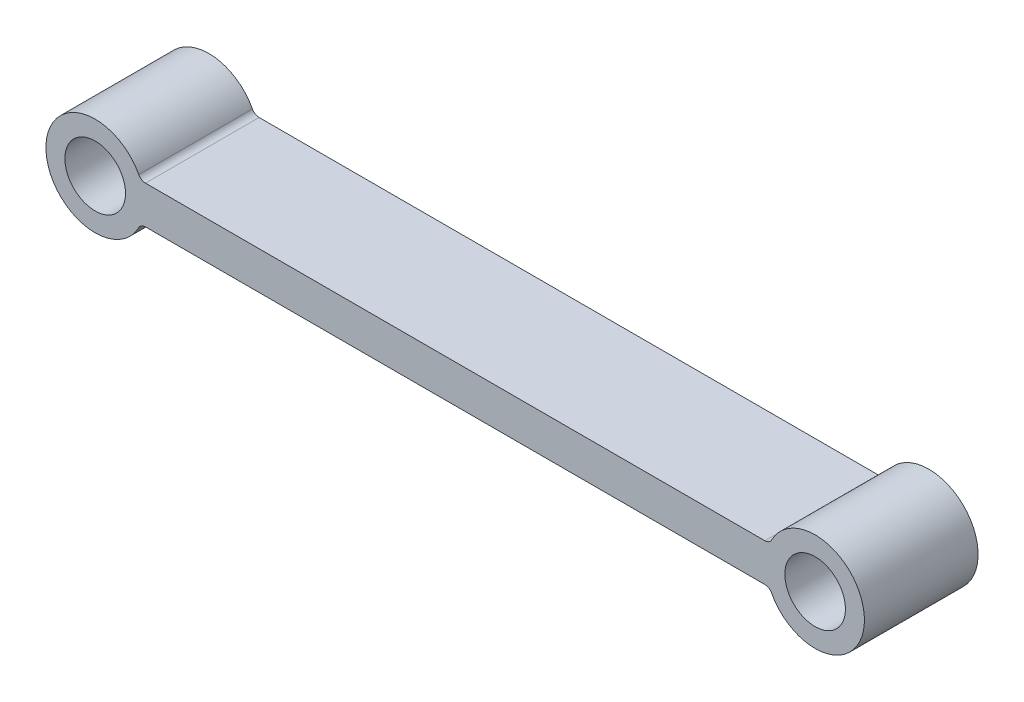
ISO-10303-21;
HEADER;
FILE_DESCRIPTION(('STEP AP214'),'2;1');
FILE_NAME('part.step','',(''),(''),'','','');
FILE_SCHEMA(('AUTOMOTIVE_DESIGN { 1 0 10303 214 1 1 1 1 }'));
ENDSEC;
DATA;
#1=APPLICATION_CONTEXT('core data for automotive mechanical design processes');
#2=APPLICATION_PROTOCOL_DEFINITION('international standard','automotive_design',2000,#1);
#3=PRODUCT_CONTEXT('',#1,'mechanical');
#4=PRODUCT('Part','Part','',(#3));
#5=PRODUCT_RELATED_PRODUCT_CATEGORY('part','',(#4));
#6=PRODUCT_DEFINITION_FORMATION('','',#4);
#7=PRODUCT_DEFINITION_CONTEXT('part definition',#1,'design');
#8=PRODUCT_DEFINITION('design','',#6,#7);
#9=PRODUCT_DEFINITION_SHAPE('','',#8);
#10=(LENGTH_UNIT() NAMED_UNIT(*) SI_UNIT(.MILLI.,.METRE.));
#11=(NAMED_UNIT(*) PLANE_ANGLE_UNIT() SI_UNIT($,.RADIAN.));
#12=(NAMED_UNIT(*) SI_UNIT($,.STERADIAN.) SOLID_ANGLE_UNIT());
#13=UNCERTAINTY_MEASURE_WITH_UNIT(LENGTH_MEASURE(1.E-05),#10,'distance_accuracy_value','');
#14=(GEOMETRIC_REPRESENTATION_CONTEXT(3) GLOBAL_UNCERTAINTY_ASSIGNED_CONTEXT((#13)) GLOBAL_UNIT_ASSIGNED_CONTEXT((#10,
#11,#12)) REPRESENTATION_CONTEXT('',''));
#15=CARTESIAN_POINT('',(0.,0.,0.));
#16=DIRECTION('',(0.,0.,1.));
#17=DIRECTION('',(1.,0.,0.));
#18=AXIS2_PLACEMENT_3D('',#15,#16,#17);
#19=CARTESIAN_POINT('',(-40.8667504192892,3.5,15.));
#20=DIRECTION('',(0.,0.,1.));
#21=DIRECTION('',(1.,0.,0.));
#22=AXIS2_PLACEMENT_3D('',#19,#20,#21);
#23=PLANE('',#22);
#24=CARTESIAN_POINT('',(-47.5,0.,15.));
#25=DIRECTION('',(0.,0.,1.));
#26=DIRECTION('',(1.,0.,0.));
#27=AXIS2_PLACEMENT_3D('',#24,#25,#26);
#28=CIRCLE('',#27,4.);
#29=CARTESIAN_POINT('',(-43.5,0.,15.));
#30=VERTEX_POINT('',#29);
#31=EDGE_CURVE('E142',#30,#30,#28,.T.);
#32=ORIENTED_EDGE('',*,*,#31,.F.);
#33=EDGE_LOOP('',(#32));
#34=FACE_BOUND('',#33,.T.);
#35=CARTESIAN_POINT('',(-40.8667504192892,3.5,15.));
#36=DIRECTION('',(0.,0.,-1.));
#37=DIRECTION('',(1.,0.,0.));
#38=AXIS2_PLACEMENT_3D('',#35,#36,#37);
#39=CIRCLE('',#38,0.999999999999999);
#40=CARTESIAN_POINT('',(-40.8667504192892,2.5,15.));
#41=VERTEX_POINT('',#40);
#42=CARTESIAN_POINT('',(-41.7511836967173,3.03333333333333,15.));
#43=VERTEX_POINT('',#42);
#44=EDGE_CURVE('E153',#41,#43,#39,.T.);
#45=ORIENTED_EDGE('',*,*,#44,.T.);
#46=CARTESIAN_POINT('',(-47.5,0.,15.));
#47=DIRECTION('',(0.,0.,1.));
#48=DIRECTION('',(1.,0.,0.));
#49=AXIS2_PLACEMENT_3D('',#46,#47,#48);
#50=CIRCLE('',#49,6.5);
#51=CARTESIAN_POINT('',(-41.7511836967173,-3.03333333333334,15.));
#52=VERTEX_POINT('',#51);
#53=EDGE_CURVE('E101',#43,#52,#50,.T.);
#54=ORIENTED_EDGE('',*,*,#53,.T.);
#55=CARTESIAN_POINT('',(-40.8667504192892,-3.5,15.));
#56=DIRECTION('',(0.,0.,-1.));
#57=DIRECTION('',(-1.,0.,0.));
#58=AXIS2_PLACEMENT_3D('',#55,#56,#57);
#59=CIRCLE('',#58,0.999999999999999);
#60=CARTESIAN_POINT('',(-40.8667504192892,-2.5,15.));
#61=VERTEX_POINT('',#60);
#62=EDGE_CURVE('E168',#52,#61,#59,.T.);
#63=ORIENTED_EDGE('',*,*,#62,.T.);
#64=DIRECTION('',(1.,0.,0.));
#65=VECTOR('',#64,1.);
#66=CARTESIAN_POINT('',(-40.8667504192892,-2.5,15.));
#67=LINE('',#66,#65);
#68=CARTESIAN_POINT('',(40.8667504192892,-2.5,15.));
#69=VERTEX_POINT('',#68);
#70=EDGE_CURVE('E181',#61,#69,#67,.T.);
#71=ORIENTED_EDGE('',*,*,#70,.T.);
#72=CARTESIAN_POINT('',(40.8667504192892,-3.5,15.));
#73=DIRECTION('',(0.,0.,-1.));
#74=DIRECTION('',(1.,0.,0.));
#75=AXIS2_PLACEMENT_3D('',#72,#73,#74);
#76=CIRCLE('',#75,0.999999999999999);
#77=CARTESIAN_POINT('',(41.7511836967173,-3.03333333333333,15.));
#78=VERTEX_POINT('',#77);
#79=EDGE_CURVE('E120',#69,#78,#76,.T.);
#80=ORIENTED_EDGE('',*,*,#79,.T.);
#81=CARTESIAN_POINT('',(47.5,0.,15.));
#82=DIRECTION('',(0.,0.,1.));
#83=DIRECTION('',(-1.,0.,0.));
#84=AXIS2_PLACEMENT_3D('',#81,#82,#83);
#85=CIRCLE('',#84,6.5);
#86=CARTESIAN_POINT('',(41.7511836967173,3.03333333333333,15.));
#87=VERTEX_POINT('',#86);
#88=EDGE_CURVE('E114',#78,#87,#85,.T.);
#89=ORIENTED_EDGE('',*,*,#88,.T.);
#90=CARTESIAN_POINT('',(40.8667504192892,3.5,15.));
#91=DIRECTION('',(0.,0.,-1.));
#92=DIRECTION('',(-1.,0.,0.));
#93=AXIS2_PLACEMENT_3D('',#90,#91,#92);
#94=CIRCLE('',#93,0.999999999999999);
#95=CARTESIAN_POINT('',(40.8667504192892,2.5,15.));
#96=VERTEX_POINT('',#95);
#97=EDGE_CURVE('E118',#87,#96,#94,.T.);
#98=ORIENTED_EDGE('',*,*,#97,.T.);
#99=DIRECTION('',(-1.,0.,0.));
#100=VECTOR('',#99,1.);
#101=CARTESIAN_POINT('',(-40.8667504192892,2.5,15.));
#102=LINE('',#101,#100);
#103=EDGE_CURVE('E58',#96,#41,#102,.T.);
#104=ORIENTED_EDGE('',*,*,#103,.T.);
#105=EDGE_LOOP('',(#45,#54,#63,#71,#80,#89,#98,#104));
#106=FACE_BOUND('',#105,.T.);
#107=CARTESIAN_POINT('',(47.5,0.,15.));
#108=DIRECTION('',(0.,0.,1.));
#109=DIRECTION('',(-1.,0.,0.));
#110=AXIS2_PLACEMENT_3D('',#107,#108,#109);
#111=CIRCLE('',#110,4.);
#112=CARTESIAN_POINT('',(43.5,0.,15.));
#113=VERTEX_POINT('',#112);
#114=EDGE_CURVE('E190',#113,#113,#111,.T.);
#115=ORIENTED_EDGE('',*,*,#114,.F.);
#116=EDGE_LOOP('',(#115));
#117=FACE_BOUND('',#116,.T.);
#118=ADVANCED_FACE('F41',(#34,#106,#117),#23,.T.);
#119=CARTESIAN_POINT('',(-40.8667504192892,3.5,0.));
#120=DIRECTION('',(0.,0.,1.));
#121=DIRECTION('',(1.,0.,0.));
#122=AXIS2_PLACEMENT_3D('',#119,#120,#121);
#123=PLANE('',#122);
#124=CARTESIAN_POINT('',(-40.8667504192892,3.5,0.));
#125=DIRECTION('',(0.,0.,-1.));
#126=DIRECTION('',(1.,0.,0.));
#127=AXIS2_PLACEMENT_3D('',#124,#125,#126);
#128=CIRCLE('',#127,0.999999999999999);
#129=CARTESIAN_POINT('',(-40.8667504192892,2.5,0.));
#130=VERTEX_POINT('',#129);
#131=CARTESIAN_POINT('',(-41.7511836967173,3.03333333333333,0.));
#132=VERTEX_POINT('',#131);
#133=EDGE_CURVE('E138',#130,#132,#128,.T.);
#134=ORIENTED_EDGE('',*,*,#133,.F.);
#135=DIRECTION('',(-1.,0.,0.));
#136=VECTOR('',#135,1.);
#137=CARTESIAN_POINT('',(-40.8667504192892,2.5,0.));
#138=LINE('',#137,#136);
#139=CARTESIAN_POINT('',(40.8667504192892,2.5,0.));
#140=VERTEX_POINT('',#139);
#141=EDGE_CURVE('E93',#140,#130,#138,.T.);
#142=ORIENTED_EDGE('',*,*,#141,.F.);
#143=CARTESIAN_POINT('',(40.8667504192892,3.5,0.));
#144=DIRECTION('',(0.,0.,-1.));
#145=DIRECTION('',(-1.,0.,0.));
#146=AXIS2_PLACEMENT_3D('',#143,#144,#145);
#147=CIRCLE('',#146,0.999999999999999);
#148=CARTESIAN_POINT('',(41.7511836967173,3.03333333333333,0.));
#149=VERTEX_POINT('',#148);
#150=EDGE_CURVE('E87',#149,#140,#147,.T.);
#151=ORIENTED_EDGE('',*,*,#150,.F.);
#152=CARTESIAN_POINT('',(47.5,0.,0.));
#153=DIRECTION('',(0.,0.,1.));
#154=DIRECTION('',(-1.,0.,0.));
#155=AXIS2_PLACEMENT_3D('',#152,#153,#154);
#156=CIRCLE('',#155,6.5);
#157=CARTESIAN_POINT('',(41.7511836967173,-3.03333333333333,0.));
#158=VERTEX_POINT('',#157);
#159=EDGE_CURVE('E128',#158,#149,#156,.T.);
#160=ORIENTED_EDGE('',*,*,#159,.F.);
#161=CARTESIAN_POINT('',(40.8667504192892,-3.5,0.));
#162=DIRECTION('',(0.,0.,-1.));
#163=DIRECTION('',(1.,0.,0.));
#164=AXIS2_PLACEMENT_3D('',#161,#162,#163);
#165=CIRCLE('',#164,0.999999999999999);
#166=CARTESIAN_POINT('',(40.8667504192892,-2.5,0.));
#167=VERTEX_POINT('',#166);
#168=EDGE_CURVE('E148',#167,#158,#165,.T.);
#169=ORIENTED_EDGE('',*,*,#168,.F.);
#170=DIRECTION('',(1.,0.,0.));
#171=VECTOR('',#170,1.);
#172=CARTESIAN_POINT('',(-40.8667504192892,-2.5,0.));
#173=LINE('',#172,#171);
#174=CARTESIAN_POINT('',(-40.8667504192892,-2.5,0.));
#175=VERTEX_POINT('',#174);
#176=EDGE_CURVE('E146',#175,#167,#173,.T.);
#177=ORIENTED_EDGE('',*,*,#176,.F.);
#178=CARTESIAN_POINT('',(-40.8667504192892,-3.5,0.));
#179=DIRECTION('',(0.,0.,-1.));
#180=DIRECTION('',(-1.,0.,0.));
#181=AXIS2_PLACEMENT_3D('',#178,#179,#180);
#182=CIRCLE('',#181,0.999999999999999);
#183=CARTESIAN_POINT('',(-41.7511836967173,-3.03333333333334,0.));
#184=VERTEX_POINT('',#183);
#185=EDGE_CURVE('E144',#184,#175,#182,.T.);
#186=ORIENTED_EDGE('',*,*,#185,.F.);
#187=CARTESIAN_POINT('',(-47.5,0.,0.));
#188=DIRECTION('',(0.,0.,1.));
#189=DIRECTION('',(1.,0.,0.));
#190=AXIS2_PLACEMENT_3D('',#187,#188,#189);
#191=CIRCLE('',#190,6.5);
#192=EDGE_CURVE('E141',#132,#184,#191,.T.);
#193=ORIENTED_EDGE('',*,*,#192,.F.);
#194=EDGE_LOOP('',(#134,#142,#151,#160,#169,#177,#186,#193));
#195=FACE_BOUND('',#194,.T.);
#196=CARTESIAN_POINT('',(-47.5,0.,0.));
#197=DIRECTION('',(0.,0.,1.));
#198=DIRECTION('',(1.,0.,0.));
#199=AXIS2_PLACEMENT_3D('',#196,#197,#198);
#200=CIRCLE('',#199,4.);
#201=CARTESIAN_POINT('',(-43.5,0.,0.));
#202=VERTEX_POINT('',#201);
#203=EDGE_CURVE('E187',#202,#202,#200,.T.);
#204=ORIENTED_EDGE('',*,*,#203,.T.);
#205=EDGE_LOOP('',(#204));
#206=FACE_BOUND('',#205,.T.);
#207=CARTESIAN_POINT('',(47.5,0.,0.));
#208=DIRECTION('',(0.,0.,1.));
#209=DIRECTION('',(-1.,0.,0.));
#210=AXIS2_PLACEMENT_3D('',#207,#208,#209);
#211=CIRCLE('',#210,4.);
#212=CARTESIAN_POINT('',(43.5,0.,0.));
#213=VERTEX_POINT('',#212);
#214=EDGE_CURVE('E193',#213,#213,#211,.T.);
#215=ORIENTED_EDGE('',*,*,#214,.T.);
#216=EDGE_LOOP('',(#215));
#217=FACE_BOUND('',#216,.T.);
#218=ADVANCED_FACE('F172',(#195,#206,#217),#123,.F.);
#219=CARTESIAN_POINT('',(-40.8667504192892,3.5,15.));
#220=DIRECTION('',(0.,0.,-1.));
#221=DIRECTION('',(-1.,0.,0.));
#222=AXIS2_PLACEMENT_3D('',#219,#220,#221);
#223=CYLINDRICAL_SURFACE('',#222,0.999999999999999);
#224=ORIENTED_EDGE('',*,*,#133,.T.);
#225=DIRECTION('',(0.,0.,-1.));
#226=VECTOR('',#225,1.);
#227=CARTESIAN_POINT('',(-41.7511836967173,3.03333333333333,15.));
#228=LINE('',#227,#226);
#229=EDGE_CURVE('E11',#43,#132,#228,.T.);
#230=ORIENTED_EDGE('',*,*,#229,.F.);
#231=ORIENTED_EDGE('',*,*,#44,.F.);
#232=DIRECTION('',(0.,0.,-1.));
#233=VECTOR('',#232,1.);
#234=CARTESIAN_POINT('',(-40.8667504192892,2.5,15.));
#235=LINE('',#234,#233);
#236=EDGE_CURVE('E134',#41,#130,#235,.T.);
#237=ORIENTED_EDGE('',*,*,#236,.T.);
#238=EDGE_LOOP('',(#224,#230,#231,#237));
#239=FACE_BOUND('',#238,.T.);
#240=ADVANCED_FACE('F43',(#239),#223,.F.);
#241=CARTESIAN_POINT('',(-47.5,0.,15.));
#242=DIRECTION('',(0.,0.,-1.));
#243=DIRECTION('',(-1.,0.,0.));
#244=AXIS2_PLACEMENT_3D('',#241,#242,#243);
#245=CYLINDRICAL_SURFACE('',#244,6.5);
#246=ORIENTED_EDGE('',*,*,#192,.T.);
#247=DIRECTION('',(0.,0.,-1.));
#248=VECTOR('',#247,1.);
#249=CARTESIAN_POINT('',(-41.7511836967173,-3.03333333333334,15.));
#250=LINE('',#249,#248);
#251=EDGE_CURVE('E50',#52,#184,#250,.T.);
#252=ORIENTED_EDGE('',*,*,#251,.F.);
#253=ORIENTED_EDGE('',*,*,#53,.F.);
#254=ORIENTED_EDGE('',*,*,#229,.T.);
#255=EDGE_LOOP('',(#246,#252,#253,#254));
#256=FACE_BOUND('',#255,.T.);
#257=ADVANCED_FACE('F225',(#256),#245,.T.);
#258=CARTESIAN_POINT('',(-40.8667504192892,-3.5,15.));
#259=DIRECTION('',(0.,0.,-1.));
#260=DIRECTION('',(-1.,0.,0.));
#261=AXIS2_PLACEMENT_3D('',#258,#259,#260);
#262=CYLINDRICAL_SURFACE('',#261,0.999999999999999);
#263=ORIENTED_EDGE('',*,*,#185,.T.);
#264=DIRECTION('',(0.,0.,-1.));
#265=VECTOR('',#264,1.);
#266=CARTESIAN_POINT('',(-40.8667504192892,-2.5,15.));
#267=LINE('',#266,#265);
#268=EDGE_CURVE('E160',#61,#175,#267,.T.);
#269=ORIENTED_EDGE('',*,*,#268,.F.);
#270=ORIENTED_EDGE('',*,*,#62,.F.);
#271=ORIENTED_EDGE('',*,*,#251,.T.);
#272=EDGE_LOOP('',(#263,#269,#270,#271));
#273=FACE_BOUND('',#272,.T.);
#274=ADVANCED_FACE('F166',(#273),#262,.F.);
#275=CARTESIAN_POINT('',(-40.8667504192892,-2.5,15.));
#276=DIRECTION('',(0.,1.,0.));
#277=DIRECTION('',(0.,0.,1.));
#278=AXIS2_PLACEMENT_3D('',#275,#276,#277);
#279=PLANE('',#278);
#280=ORIENTED_EDGE('',*,*,#176,.T.);
#281=DIRECTION('',(0.,0.,-1.));
#282=VECTOR('',#281,1.);
#283=CARTESIAN_POINT('',(40.8667504192892,-2.5,15.));
#284=LINE('',#283,#282);
#285=EDGE_CURVE('E157',#69,#167,#284,.T.);
#286=ORIENTED_EDGE('',*,*,#285,.F.);
#287=ORIENTED_EDGE('',*,*,#70,.F.);
#288=ORIENTED_EDGE('',*,*,#268,.T.);
#289=EDGE_LOOP('',(#280,#286,#287,#288));
#290=FACE_BOUND('',#289,.T.);
#291=ADVANCED_FACE('F177',(#290),#279,.F.);
#292=CARTESIAN_POINT('',(40.8667504192892,-3.5,15.));
#293=DIRECTION('',(0.,0.,-1.));
#294=DIRECTION('',(-1.,0.,0.));
#295=AXIS2_PLACEMENT_3D('',#292,#293,#294);
#296=CYLINDRICAL_SURFACE('',#295,0.999999999999999);
#297=ORIENTED_EDGE('',*,*,#168,.T.);
#298=DIRECTION('',(0.,0.,-1.));
#299=VECTOR('',#298,1.);
#300=CARTESIAN_POINT('',(41.7511836967173,-3.03333333333333,15.));
#301=LINE('',#300,#299);
#302=EDGE_CURVE('E129',#78,#158,#301,.T.);
#303=ORIENTED_EDGE('',*,*,#302,.F.);
#304=ORIENTED_EDGE('',*,*,#79,.F.);
#305=ORIENTED_EDGE('',*,*,#285,.T.);
#306=EDGE_LOOP('',(#297,#303,#304,#305));
#307=FACE_BOUND('',#306,.T.);
#308=ADVANCED_FACE('F180',(#307),#296,.F.);
#309=CARTESIAN_POINT('',(47.5,0.,15.));
#310=DIRECTION('',(0.,0.,-1.));
#311=DIRECTION('',(-1.,0.,0.));
#312=AXIS2_PLACEMENT_3D('',#309,#310,#311);
#313=CYLINDRICAL_SURFACE('',#312,6.5);
#314=ORIENTED_EDGE('',*,*,#159,.T.);
#315=DIRECTION('',(0.,0.,-1.));
#316=VECTOR('',#315,1.);
#317=CARTESIAN_POINT('',(41.7511836967173,3.03333333333333,15.));
#318=LINE('',#317,#316);
#319=EDGE_CURVE('E125',#87,#149,#318,.T.);
#320=ORIENTED_EDGE('',*,*,#319,.F.);
#321=ORIENTED_EDGE('',*,*,#88,.F.);
#322=ORIENTED_EDGE('',*,*,#302,.T.);
#323=EDGE_LOOP('',(#314,#320,#321,#322));
#324=FACE_BOUND('',#323,.T.);
#325=ADVANCED_FACE('F126',(#324),#313,.T.);
#326=CARTESIAN_POINT('',(40.8667504192892,3.5,15.));
#327=DIRECTION('',(0.,0.,-1.));
#328=DIRECTION('',(-1.,0.,0.));
#329=AXIS2_PLACEMENT_3D('',#326,#327,#328);
#330=CYLINDRICAL_SURFACE('',#329,0.999999999999999);
#331=ORIENTED_EDGE('',*,*,#150,.T.);
#332=DIRECTION('',(0.,0.,-1.));
#333=VECTOR('',#332,1.);
#334=CARTESIAN_POINT('',(40.8667504192892,2.5,15.));
#335=LINE('',#334,#333);
#336=EDGE_CURVE('E130',#96,#140,#335,.T.);
#337=ORIENTED_EDGE('',*,*,#336,.F.);
#338=ORIENTED_EDGE('',*,*,#97,.F.);
#339=ORIENTED_EDGE('',*,*,#319,.T.);
#340=EDGE_LOOP('',(#331,#337,#338,#339));
#341=FACE_BOUND('',#340,.T.);
#342=ADVANCED_FACE('F132',(#341),#330,.F.);
#343=CARTESIAN_POINT('',(-40.8667504192892,2.5,15.));
#344=DIRECTION('',(0.,-1.,0.));
#345=DIRECTION('',(0.,0.,-1.));
#346=AXIS2_PLACEMENT_3D('',#343,#344,#345);
#347=PLANE('',#346);
#348=ORIENTED_EDGE('',*,*,#141,.T.);
#349=ORIENTED_EDGE('',*,*,#236,.F.);
#350=ORIENTED_EDGE('',*,*,#103,.F.);
#351=ORIENTED_EDGE('',*,*,#336,.T.);
#352=EDGE_LOOP('',(#348,#349,#350,#351));
#353=FACE_BOUND('',#352,.T.);
#354=ADVANCED_FACE('F213',(#353),#347,.F.);
#355=CARTESIAN_POINT('',(-47.5,0.,15.));
#356=DIRECTION('',(0.,0.,-1.));
#357=DIRECTION('',(-1.,0.,0.));
#358=AXIS2_PLACEMENT_3D('',#355,#356,#357);
#359=CYLINDRICAL_SURFACE('',#358,4.);
#360=ORIENTED_EDGE('',*,*,#31,.T.);
#361=EDGE_LOOP('',(#360));
#362=FACE_BOUND('',#361,.T.);
#363=ORIENTED_EDGE('',*,*,#203,.F.);
#364=EDGE_LOOP('',(#363));
#365=FACE_BOUND('',#364,.T.);
#366=ADVANCED_FACE('F210',(#362,#365),#359,.F.);
#367=CARTESIAN_POINT('',(47.5,0.,15.));
#368=DIRECTION('',(0.,0.,-1.));
#369=DIRECTION('',(-1.,0.,0.));
#370=AXIS2_PLACEMENT_3D('',#367,#368,#369);
#371=CYLINDRICAL_SURFACE('',#370,4.);
#372=ORIENTED_EDGE('',*,*,#114,.T.);
#373=EDGE_LOOP('',(#372));
#374=FACE_BOUND('',#373,.T.);
#375=ORIENTED_EDGE('',*,*,#214,.F.);
#376=EDGE_LOOP('',(#375));
#377=FACE_BOUND('',#376,.T.);
#378=ADVANCED_FACE('F199',(#374,#377),#371,.F.);
#379=CLOSED_SHELL('',(#118,#218,#240,#257,#274,#291,#308,#325,#342,#354,#366,#378));
#380=MANIFOLD_SOLID_BREP('B2',#379);
#381=ADVANCED_BREP_SHAPE_REPRESENTATION('',(#18,#380),#14);
#382=SHAPE_DEFINITION_REPRESENTATION(#9,#381);
ENDSEC;
END-ISO-10303-21;
